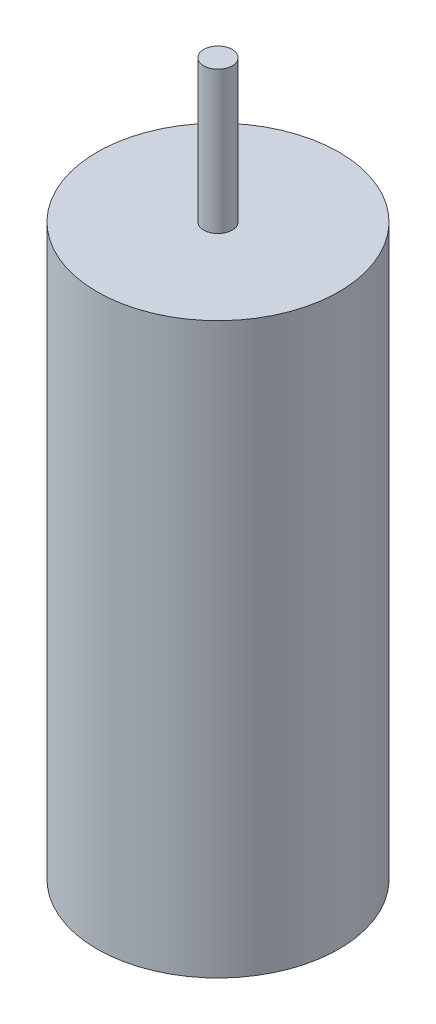
ISO-10303-21;
HEADER;
FILE_DESCRIPTION(('STEP AP214'),'2;1');
FILE_NAME('part.step','',(''),(''),'','','');
FILE_SCHEMA(('AUTOMOTIVE_DESIGN { 1 0 10303 214 1 1 1 1 }'));
ENDSEC;
DATA;
#1=APPLICATION_CONTEXT('core data for automotive mechanical design processes');
#2=APPLICATION_PROTOCOL_DEFINITION('international standard','automotive_design',2000,#1);
#3=PRODUCT_CONTEXT('',#1,'mechanical');
#4=PRODUCT('Part','Part','',(#3));
#5=PRODUCT_RELATED_PRODUCT_CATEGORY('part','',(#4));
#6=PRODUCT_DEFINITION_FORMATION('','',#4);
#7=PRODUCT_DEFINITION_CONTEXT('part definition',#1,'design');
#8=PRODUCT_DEFINITION('design','',#6,#7);
#9=PRODUCT_DEFINITION_SHAPE('','',#8);
#10=(LENGTH_UNIT() NAMED_UNIT(*) SI_UNIT(.MILLI.,.METRE.));
#11=(NAMED_UNIT(*) PLANE_ANGLE_UNIT() SI_UNIT($,.RADIAN.));
#12=(NAMED_UNIT(*) SI_UNIT($,.STERADIAN.) SOLID_ANGLE_UNIT());
#13=UNCERTAINTY_MEASURE_WITH_UNIT(LENGTH_MEASURE(1.E-05),#10,'distance_accuracy_value','');
#14=(GEOMETRIC_REPRESENTATION_CONTEXT(3) GLOBAL_UNCERTAINTY_ASSIGNED_CONTEXT((#13)) GLOBAL_UNIT_ASSIGNED_CONTEXT((#10,
#11,#12)) REPRESENTATION_CONTEXT('',''));
#15=CARTESIAN_POINT('',(0.,0.,0.));
#16=DIRECTION('',(0.,0.,1.));
#17=DIRECTION('',(1.,0.,0.));
#18=AXIS2_PLACEMENT_3D('',#15,#16,#17);
#19=CARTESIAN_POINT('',(0.,20.,0.));
#20=DIRECTION('',(0.,-1.,0.));
#21=DIRECTION('',(0.,0.,-1.));
#22=AXIS2_PLACEMENT_3D('',#19,#20,#21);
#23=CYLINDRICAL_SURFACE('',#22,4.25);
#24=CARTESIAN_POINT('',(0.,20.,0.));
#25=DIRECTION('',(0.,1.,0.));
#26=DIRECTION('',(0.,0.,1.));
#27=AXIS2_PLACEMENT_3D('',#24,#25,#26);
#28=CIRCLE('',#27,4.25);
#29=CARTESIAN_POINT('',(0.,20.,4.25));
#30=VERTEX_POINT('',#29);
#31=EDGE_CURVE('E10',#30,#30,#28,.T.);
#32=ORIENTED_EDGE('',*,*,#31,.F.);
#33=EDGE_LOOP('',(#32));
#34=FACE_BOUND('',#33,.T.);
#35=CARTESIAN_POINT('',(0.,0.,0.));
#36=DIRECTION('',(0.,1.,0.));
#37=DIRECTION('',(0.,0.,1.));
#38=AXIS2_PLACEMENT_3D('',#35,#36,#37);
#39=CIRCLE('',#38,4.25);
#40=CARTESIAN_POINT('',(0.,0.,4.25));
#41=VERTEX_POINT('',#40);
#42=EDGE_CURVE('E34',#41,#41,#39,.T.);
#43=ORIENTED_EDGE('',*,*,#42,.T.);
#44=EDGE_LOOP('',(#43));
#45=FACE_BOUND('',#44,.T.);
#46=ADVANCED_FACE('F31',(#34,#45),#23,.T.);
#47=CARTESIAN_POINT('',(0.,20.,0.));
#48=DIRECTION('',(0.,1.,0.));
#49=DIRECTION('',(0.,0.,1.));
#50=AXIS2_PLACEMENT_3D('',#47,#48,#49);
#51=PLANE('',#50);
#52=CARTESIAN_POINT('',(0.,20.,0.));
#53=DIRECTION('',(0.,1.,0.));
#54=DIRECTION('',(0.,0.,1.));
#55=AXIS2_PLACEMENT_3D('',#52,#53,#54);
#56=CIRCLE('',#55,0.5);
#57=CARTESIAN_POINT('',(0.,20.,0.5));
#58=VERTEX_POINT('',#57);
#59=EDGE_CURVE('E43',#58,#58,#56,.T.);
#60=ORIENTED_EDGE('',*,*,#59,.F.);
#61=EDGE_LOOP('',(#60));
#62=FACE_BOUND('',#61,.T.);
#63=ORIENTED_EDGE('',*,*,#31,.T.);
#64=EDGE_LOOP('',(#63));
#65=FACE_BOUND('',#64,.T.);
#66=ADVANCED_FACE('F58',(#62,#65),#51,.T.);
#67=CARTESIAN_POINT('',(0.,0.,0.));
#68=DIRECTION('',(0.,1.,0.));
#69=DIRECTION('',(0.,0.,1.));
#70=AXIS2_PLACEMENT_3D('',#67,#68,#69);
#71=PLANE('',#70);
#72=ORIENTED_EDGE('',*,*,#42,.F.);
#73=EDGE_LOOP('',(#72));
#74=FACE_BOUND('',#73,.T.);
#75=ADVANCED_FACE('F54',(#74),#71,.F.);
#76=CARTESIAN_POINT('',(0.,25.,0.));
#77=DIRECTION('',(0.,-1.,0.));
#78=DIRECTION('',(0.,0.,-1.));
#79=AXIS2_PLACEMENT_3D('',#76,#77,#78);
#80=CYLINDRICAL_SURFACE('',#79,0.5);
#81=CARTESIAN_POINT('',(0.,25.,0.));
#82=DIRECTION('',(0.,1.,0.));
#83=DIRECTION('',(0.,0.,1.));
#84=AXIS2_PLACEMENT_3D('',#81,#82,#83);
#85=CIRCLE('',#84,0.5);
#86=CARTESIAN_POINT('',(0.,25.,0.5));
#87=VERTEX_POINT('',#86);
#88=EDGE_CURVE('E41',#87,#87,#85,.T.);
#89=ORIENTED_EDGE('',*,*,#88,.F.);
#90=EDGE_LOOP('',(#89));
#91=FACE_BOUND('',#90,.T.);
#92=ORIENTED_EDGE('',*,*,#59,.T.);
#93=EDGE_LOOP('',(#92));
#94=FACE_BOUND('',#93,.T.);
#95=ADVANCED_FACE('F51',(#91,#94),#80,.T.);
#96=CARTESIAN_POINT('',(0.,25.,0.));
#97=DIRECTION('',(0.,1.,0.));
#98=DIRECTION('',(0.,0.,1.));
#99=AXIS2_PLACEMENT_3D('',#96,#97,#98);
#100=PLANE('',#99);
#101=ORIENTED_EDGE('',*,*,#88,.T.);
#102=EDGE_LOOP('',(#101));
#103=FACE_BOUND('',#102,.T.);
#104=ADVANCED_FACE('F49',(#103),#100,.T.);
#105=CLOSED_SHELL('',(#46,#66,#75,#95,#104));
#106=MANIFOLD_SOLID_BREP('B2',#105);
#107=ADVANCED_BREP_SHAPE_REPRESENTATION('',(#18,#106),#14);
#108=SHAPE_DEFINITION_REPRESENTATION(#9,#107);
ENDSEC;
END-ISO-10303-21;
